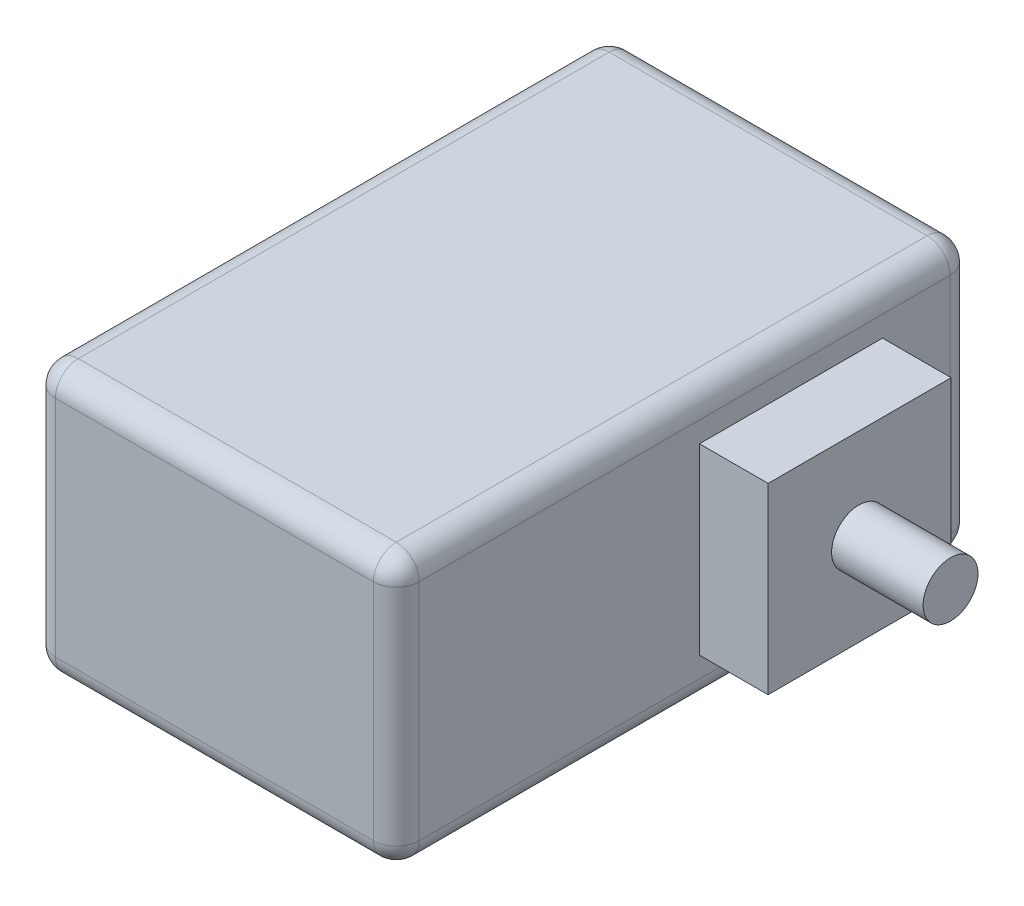
ISO-10303-21;
HEADER;
FILE_DESCRIPTION(('STEP AP214'),'2;1');
FILE_NAME('part.step','',(''),(''),'','','');
FILE_SCHEMA(('AUTOMOTIVE_DESIGN { 1 0 10303 214 1 1 1 1 }'));
ENDSEC;
DATA;
#1=APPLICATION_CONTEXT('core data for automotive mechanical design processes');
#2=APPLICATION_PROTOCOL_DEFINITION('international standard','automotive_design',2000,#1);
#3=PRODUCT_CONTEXT('',#1,'mechanical');
#4=PRODUCT('Part','Part','',(#3));
#5=PRODUCT_RELATED_PRODUCT_CATEGORY('part','',(#4));
#6=PRODUCT_DEFINITION_FORMATION('','',#4);
#7=PRODUCT_DEFINITION_CONTEXT('part definition',#1,'design');
#8=PRODUCT_DEFINITION('design','',#6,#7);
#9=PRODUCT_DEFINITION_SHAPE('','',#8);
#10=(LENGTH_UNIT() NAMED_UNIT(*) SI_UNIT(.MILLI.,.METRE.));
#11=(NAMED_UNIT(*) PLANE_ANGLE_UNIT() SI_UNIT($,.RADIAN.));
#12=(NAMED_UNIT(*) SI_UNIT($,.STERADIAN.) SOLID_ANGLE_UNIT());
#13=UNCERTAINTY_MEASURE_WITH_UNIT(LENGTH_MEASURE(1.E-05),#10,'distance_accuracy_value','');
#14=(GEOMETRIC_REPRESENTATION_CONTEXT(3) GLOBAL_UNCERTAINTY_ASSIGNED_CONTEXT((#13)) GLOBAL_UNIT_ASSIGNED_CONTEXT((#10,
#11,#12)) REPRESENTATION_CONTEXT('',''));
#15=CARTESIAN_POINT('',(0.,0.,0.));
#16=DIRECTION('',(0.,0.,1.));
#17=DIRECTION('',(1.,0.,0.));
#18=AXIS2_PLACEMENT_3D('',#15,#16,#17);
#19=CARTESIAN_POINT('',(79.5,-59.,126.));
#20=DIRECTION('',(-1.,0.,0.));
#21=DIRECTION('',(0.,0.,1.));
#22=AXIS2_PLACEMENT_3D('',#19,#20,#21);
#23=PLANE('',#22);
#24=DIRECTION('',(0.,1.,0.));
#25=VECTOR('',#24,1.);
#26=CARTESIAN_POINT('',(79.5,-59.,116.));
#27=LINE('',#26,#25);
#28=CARTESIAN_POINT('',(79.5,49.,116.));
#29=VERTEX_POINT('',#28);
#30=CARTESIAN_POINT('',(79.5,-49.,116.));
#31=VERTEX_POINT('',#30);
#32=EDGE_CURVE('E260',#29,#31,#27,.F.);
#33=ORIENTED_EDGE('',*,*,#32,.T.);
#34=DIRECTION('',(0.,0.,-1.));
#35=VECTOR('',#34,1.);
#36=CARTESIAN_POINT('',(79.5,-49.,126.));
#37=LINE('',#36,#35);
#38=CARTESIAN_POINT('',(79.5,-49.,-116.));
#39=VERTEX_POINT('',#38);
#40=EDGE_CURVE('E49',#31,#39,#37,.T.);
#41=ORIENTED_EDGE('',*,*,#40,.T.);
#42=DIRECTION('',(0.,1.,0.));
#43=VECTOR('',#42,1.);
#44=CARTESIAN_POINT('',(79.5,59.,-116.));
#45=LINE('',#44,#43);
#46=CARTESIAN_POINT('',(79.5,49.,-116.));
#47=VERTEX_POINT('',#46);
#48=EDGE_CURVE('E257',#39,#47,#45,.T.);
#49=ORIENTED_EDGE('',*,*,#48,.T.);
#50=DIRECTION('',(0.,0.,-1.));
#51=VECTOR('',#50,1.);
#52=CARTESIAN_POINT('',(79.5,49.,126.));
#53=LINE('',#52,#51);
#54=EDGE_CURVE('E254',#47,#29,#53,.F.);
#55=ORIENTED_EDGE('',*,*,#54,.T.);
#56=EDGE_LOOP('',(#33,#41,#49,#55));
#57=FACE_BOUND('',#56,.T.);
#58=DIRECTION('',(0.,1.,0.));
#59=VECTOR('',#58,1.);
#60=CARTESIAN_POINT('',(79.5,-40.,-86.5));
#61=LINE('',#60,#59);
#62=CARTESIAN_POINT('',(79.5,-40.,-86.5));
#63=VERTEX_POINT('',#62);
#64=CARTESIAN_POINT('',(79.5,40.,-86.5));
#65=VERTEX_POINT('',#64);
#66=EDGE_CURVE('E177',#63,#65,#61,.T.);
#67=ORIENTED_EDGE('',*,*,#66,.F.);
#68=DIRECTION('',(0.,0.,-1.));
#69=VECTOR('',#68,1.);
#70=CARTESIAN_POINT('',(79.5,-40.,-6.49999999999998));
#71=LINE('',#70,#69);
#72=CARTESIAN_POINT('',(79.5,-40.,-6.49999999999998));
#73=VERTEX_POINT('',#72);
#74=EDGE_CURVE('E174',#73,#63,#71,.T.);
#75=ORIENTED_EDGE('',*,*,#74,.F.);
#76=DIRECTION('',(0.,-1.,0.));
#77=VECTOR('',#76,1.);
#78=CARTESIAN_POINT('',(79.5,-40.,-6.49999999999998));
#79=LINE('',#78,#77);
#80=CARTESIAN_POINT('',(79.5,40.,-6.49999999999998));
#81=VERTEX_POINT('',#80);
#82=EDGE_CURVE('E62',#81,#73,#79,.T.);
#83=ORIENTED_EDGE('',*,*,#82,.F.);
#84=DIRECTION('',(0.,0.,1.));
#85=VECTOR('',#84,1.);
#86=CARTESIAN_POINT('',(79.5,40.,-6.49999999999998));
#87=LINE('',#86,#85);
#88=EDGE_CURVE('E57',#65,#81,#87,.T.);
#89=ORIENTED_EDGE('',*,*,#88,.F.);
#90=EDGE_LOOP('',(#67,#75,#83,#89));
#91=FACE_BOUND('',#90,.T.);
#92=ADVANCED_FACE('F39',(#57,#91),#23,.F.);
#93=CARTESIAN_POINT('',(-79.5,59.,126.));
#94=DIRECTION('',(0.,-1.,0.));
#95=DIRECTION('',(0.,0.,-1.));
#96=AXIS2_PLACEMENT_3D('',#93,#94,#95);
#97=PLANE('',#96);
#98=DIRECTION('',(-1.,0.,0.));
#99=VECTOR('',#98,1.);
#100=CARTESIAN_POINT('',(-79.5,59.,116.));
#101=LINE('',#100,#99);
#102=CARTESIAN_POINT('',(-69.5,59.,116.));
#103=VERTEX_POINT('',#102);
#104=CARTESIAN_POINT('',(69.5,59.,116.));
#105=VERTEX_POINT('',#104);
#106=EDGE_CURVE('E247',#103,#105,#101,.F.);
#107=ORIENTED_EDGE('',*,*,#106,.T.);
#108=DIRECTION('',(0.,0.,-1.));
#109=VECTOR('',#108,1.);
#110=CARTESIAN_POINT('',(69.5,59.,126.));
#111=LINE('',#110,#109);
#112=CARTESIAN_POINT('',(69.5,59.,-116.));
#113=VERTEX_POINT('',#112);
#114=EDGE_CURVE('E251',#105,#113,#111,.T.);
#115=ORIENTED_EDGE('',*,*,#114,.T.);
#116=DIRECTION('',(-1.,0.,0.));
#117=VECTOR('',#116,1.);
#118=CARTESIAN_POINT('',(-79.5,59.,-116.));
#119=LINE('',#118,#117);
#120=CARTESIAN_POINT('',(-69.5,59.,-116.));
#121=VERTEX_POINT('',#120);
#122=EDGE_CURVE('E244',#113,#121,#119,.T.);
#123=ORIENTED_EDGE('',*,*,#122,.T.);
#124=DIRECTION('',(0.,0.,-1.));
#125=VECTOR('',#124,1.);
#126=CARTESIAN_POINT('',(-69.5,59.,126.));
#127=LINE('',#126,#125);
#128=EDGE_CURVE('E241',#121,#103,#127,.F.);
#129=ORIENTED_EDGE('',*,*,#128,.T.);
#130=EDGE_LOOP('',(#107,#115,#123,#129));
#131=FACE_BOUND('',#130,.T.);
#132=ADVANCED_FACE('F370',(#131),#97,.F.);
#133=CARTESIAN_POINT('',(-79.5,-59.,126.));
#134=DIRECTION('',(1.,0.,0.));
#135=DIRECTION('',(0.,0.,-1.));
#136=AXIS2_PLACEMENT_3D('',#133,#134,#135);
#137=PLANE('',#136);
#138=CARTESIAN_POINT('',(-79.5,26.75,93.0823021399908));
#139=DIRECTION('',(-1.,0.,0.));
#140=DIRECTION('',(0.,0.,1.));
#141=AXIS2_PLACEMENT_3D('',#138,#139,#140);
#142=CIRCLE('',#141,8.50000000000001);
#143=CARTESIAN_POINT('',(-79.5,26.75,101.582302139991));
#144=VERTEX_POINT('',#143);
#145=EDGE_CURVE('E841',#144,#144,#142,.T.);
#146=ORIENTED_EDGE('',*,*,#145,.F.);
#147=EDGE_LOOP('',(#146));
#148=FACE_BOUND('',#147,.T.);
#149=CARTESIAN_POINT('',(-79.5,-26.75,93.0823021399908));
#150=DIRECTION('',(-1.,0.,0.));
#151=DIRECTION('',(0.,0.,1.));
#152=AXIS2_PLACEMENT_3D('',#149,#150,#151);
#153=CIRCLE('',#152,10.5);
#154=CARTESIAN_POINT('',(-79.5,-26.75,103.582302139991));
#155=VERTEX_POINT('',#154);
#156=EDGE_CURVE('E844',#155,#155,#153,.T.);
#157=ORIENTED_EDGE('',*,*,#156,.F.);
#158=EDGE_LOOP('',(#157));
#159=FACE_BOUND('',#158,.T.);
#160=DIRECTION('',(0.,-1.,0.));
#161=VECTOR('',#160,1.);
#162=CARTESIAN_POINT('',(-79.5,-59.,-116.));
#163=LINE('',#162,#161);
#164=CARTESIAN_POINT('',(-79.5,49.,-116.));
#165=VERTEX_POINT('',#164);
#166=CARTESIAN_POINT('',(-79.5,-49.,-116.));
#167=VERTEX_POINT('',#166);
#168=EDGE_CURVE('E195',#165,#167,#163,.T.);
#169=ORIENTED_EDGE('',*,*,#168,.T.);
#170=DIRECTION('',(0.,0.,-1.));
#171=VECTOR('',#170,1.);
#172=CARTESIAN_POINT('',(-79.5,-49.,126.));
#173=LINE('',#172,#171);
#174=CARTESIAN_POINT('',(-79.5,-49.,116.));
#175=VERTEX_POINT('',#174);
#176=EDGE_CURVE('E199',#167,#175,#173,.F.);
#177=ORIENTED_EDGE('',*,*,#176,.T.);
#178=DIRECTION('',(0.,-1.,0.));
#179=VECTOR('',#178,1.);
#180=CARTESIAN_POINT('',(-79.5,-59.,116.));
#181=LINE('',#180,#179);
#182=CARTESIAN_POINT('',(-79.5,49.,116.));
#183=VERTEX_POINT('',#182);
#184=EDGE_CURVE('E192',#175,#183,#181,.F.);
#185=ORIENTED_EDGE('',*,*,#184,.T.);
#186=DIRECTION('',(0.,0.,-1.));
#187=VECTOR('',#186,1.);
#188=CARTESIAN_POINT('',(-79.5,49.,126.));
#189=LINE('',#188,#187);
#190=EDGE_CURVE('E189',#183,#165,#189,.T.);
#191=ORIENTED_EDGE('',*,*,#190,.T.);
#192=EDGE_LOOP('',(#169,#177,#185,#191));
#193=FACE_BOUND('',#192,.T.);
#194=ADVANCED_FACE('F388',(#148,#159,#193),#137,.F.);
#195=CARTESIAN_POINT('',(-79.5,-59.,126.));
#196=DIRECTION('',(0.,1.,0.));
#197=DIRECTION('',(0.,0.,1.));
#198=AXIS2_PLACEMENT_3D('',#195,#196,#197);
#199=PLANE('',#198);
#200=CARTESIAN_POINT('',(-38.5,-59.,-8.99999999999999));
#201=DIRECTION('',(0.,-1.,0.));
#202=DIRECTION('',(0.,0.,-1.));
#203=AXIS2_PLACEMENT_3D('',#200,#201,#202);
#204=CIRCLE('',#203,7.94064544972005);
#205=CARTESIAN_POINT('',(-38.5,-59.,-16.94064544972));
#206=VERTEX_POINT('',#205);
#207=EDGE_CURVE('E892',#206,#206,#204,.T.);
#208=ORIENTED_EDGE('',*,*,#207,.F.);
#209=EDGE_LOOP('',(#208));
#210=FACE_BOUND('',#209,.T.);
#211=CARTESIAN_POINT('',(56.5,-59.,-8.99999999999999));
#212=DIRECTION('',(0.,-1.,0.));
#213=DIRECTION('',(0.,0.,-1.));
#214=AXIS2_PLACEMENT_3D('',#211,#212,#213);
#215=CIRCLE('',#214,7.94064544972005);
#216=CARTESIAN_POINT('',(56.5,-59.,-16.94064544972));
#217=VERTEX_POINT('',#216);
#218=EDGE_CURVE('E900',#217,#217,#215,.T.);
#219=ORIENTED_EDGE('',*,*,#218,.F.);
#220=EDGE_LOOP('',(#219));
#221=FACE_BOUND('',#220,.T.);
#222=CARTESIAN_POINT('',(56.5,-59.,-84.));
#223=DIRECTION('',(0.,-1.,0.));
#224=DIRECTION('',(0.,0.,-1.));
#225=AXIS2_PLACEMENT_3D('',#222,#223,#224);
#226=CIRCLE('',#225,7.94064544972005);
#227=CARTESIAN_POINT('',(56.5,-59.,-91.94064544972));
#228=VERTEX_POINT('',#227);
#229=EDGE_CURVE('E908',#228,#228,#226,.T.);
#230=ORIENTED_EDGE('',*,*,#229,.F.);
#231=EDGE_LOOP('',(#230));
#232=FACE_BOUND('',#231,.T.);
#233=CARTESIAN_POINT('',(-38.5,-59.,-84.));
#234=DIRECTION('',(0.,-1.,0.));
#235=DIRECTION('',(0.,0.,-1.));
#236=AXIS2_PLACEMENT_3D('',#233,#234,#235);
#237=CIRCLE('',#236,7.94064544972006);
#238=CARTESIAN_POINT('',(-38.5,-59.,-91.9406454497201));
#239=VERTEX_POINT('',#238);
#240=EDGE_CURVE('E855',#239,#239,#237,.T.);
#241=ORIENTED_EDGE('',*,*,#240,.F.);
#242=EDGE_LOOP('',(#241));
#243=FACE_BOUND('',#242,.T.);
#244=DIRECTION('',(1.,0.,0.));
#245=VECTOR('',#244,1.);
#246=CARTESIAN_POINT('',(79.5,-59.,-116.));
#247=LINE('',#246,#245);
#248=CARTESIAN_POINT('',(-69.5,-59.,-116.));
#249=VERTEX_POINT('',#248);
#250=CARTESIAN_POINT('',(69.5,-59.,-116.));
#251=VERTEX_POINT('',#250);
#252=EDGE_CURVE('E221',#249,#251,#247,.T.);
#253=ORIENTED_EDGE('',*,*,#252,.T.);
#254=DIRECTION('',(0.,0.,-1.));
#255=VECTOR('',#254,1.);
#256=CARTESIAN_POINT('',(69.5,-59.,126.));
#257=LINE('',#256,#255);
#258=CARTESIAN_POINT('',(69.5,-59.,116.));
#259=VERTEX_POINT('',#258);
#260=EDGE_CURVE('E225',#251,#259,#257,.F.);
#261=ORIENTED_EDGE('',*,*,#260,.T.);
#262=DIRECTION('',(1.,0.,0.));
#263=VECTOR('',#262,1.);
#264=CARTESIAN_POINT('',(-79.5,-59.,116.));
#265=LINE('',#264,#263);
#266=CARTESIAN_POINT('',(-69.5,-59.,116.));
#267=VERTEX_POINT('',#266);
#268=EDGE_CURVE('E218',#259,#267,#265,.F.);
#269=ORIENTED_EDGE('',*,*,#268,.T.);
#270=DIRECTION('',(0.,0.,-1.));
#271=VECTOR('',#270,1.);
#272=CARTESIAN_POINT('',(-69.5,-59.,126.));
#273=LINE('',#272,#271);
#274=EDGE_CURVE('E215',#267,#249,#273,.T.);
#275=ORIENTED_EDGE('',*,*,#274,.T.);
#276=EDGE_LOOP('',(#253,#261,#269,#275));
#277=FACE_BOUND('',#276,.T.);
#278=ADVANCED_FACE('F802',(#210,#221,#232,#243,#277),#199,.F.);
#279=CARTESIAN_POINT('',(0.,0.,126.));
#280=DIRECTION('',(0.,0.,-1.));
#281=DIRECTION('',(-1.,0.,0.));
#282=AXIS2_PLACEMENT_3D('',#279,#280,#281);
#283=PLANE('',#282);
#284=DIRECTION('',(-1.,0.,0.));
#285=VECTOR('',#284,1.);
#286=CARTESIAN_POINT('',(0.,49.,126.));
#287=LINE('',#286,#285);
#288=CARTESIAN_POINT('',(69.5,49.,126.));
#289=VERTEX_POINT('',#288);
#290=CARTESIAN_POINT('',(-69.5,49.,126.));
#291=VERTEX_POINT('',#290);
#292=EDGE_CURVE('E231',#289,#291,#287,.T.);
#293=ORIENTED_EDGE('',*,*,#292,.T.);
#294=DIRECTION('',(0.,-1.,0.));
#295=VECTOR('',#294,1.);
#296=CARTESIAN_POINT('',(-69.5,0.,126.));
#297=LINE('',#296,#295);
#298=CARTESIAN_POINT('',(-69.5,-49.,126.));
#299=VERTEX_POINT('',#298);
#300=EDGE_CURVE('E238',#291,#299,#297,.T.);
#301=ORIENTED_EDGE('',*,*,#300,.T.);
#302=DIRECTION('',(1.,0.,0.));
#303=VECTOR('',#302,1.);
#304=CARTESIAN_POINT('',(0.,-49.,126.));
#305=LINE('',#304,#303);
#306=CARTESIAN_POINT('',(69.5,-49.,126.));
#307=VERTEX_POINT('',#306);
#308=EDGE_CURVE('E234',#299,#307,#305,.T.);
#309=ORIENTED_EDGE('',*,*,#308,.T.);
#310=DIRECTION('',(0.,1.,0.));
#311=VECTOR('',#310,1.);
#312=CARTESIAN_POINT('',(69.5,0.,126.));
#313=LINE('',#312,#311);
#314=EDGE_CURVE('E228',#307,#289,#313,.T.);
#315=ORIENTED_EDGE('',*,*,#314,.T.);
#316=EDGE_LOOP('',(#293,#301,#309,#315));
#317=FACE_BOUND('',#316,.T.);
#318=ADVANCED_FACE('F398',(#317),#283,.F.);
#319=CARTESIAN_POINT('',(0.,0.,-126.));
#320=DIRECTION('',(0.,0.,-1.));
#321=DIRECTION('',(-1.,0.,0.));
#322=AXIS2_PLACEMENT_3D('',#319,#320,#321);
#323=PLANE('',#322);
#324=DIRECTION('',(1.,0.,0.));
#325=VECTOR('',#324,1.);
#326=CARTESIAN_POINT('',(-79.5,-49.,-126.));
#327=LINE('',#326,#325);
#328=CARTESIAN_POINT('',(69.5,-49.,-126.));
#329=VERTEX_POINT('',#328);
#330=CARTESIAN_POINT('',(-69.5,-49.,-126.));
#331=VERTEX_POINT('',#330);
#332=EDGE_CURVE('E208',#329,#331,#327,.F.);
#333=ORIENTED_EDGE('',*,*,#332,.T.);
#334=DIRECTION('',(0.,-1.,0.));
#335=VECTOR('',#334,1.);
#336=CARTESIAN_POINT('',(-69.5,59.,-126.));
#337=LINE('',#336,#335);
#338=CARTESIAN_POINT('',(-69.5,49.,-126.));
#339=VERTEX_POINT('',#338);
#340=EDGE_CURVE('E211',#331,#339,#337,.F.);
#341=ORIENTED_EDGE('',*,*,#340,.T.);
#342=DIRECTION('',(-1.,0.,0.));
#343=VECTOR('',#342,1.);
#344=CARTESIAN_POINT('',(79.5,49.,-126.));
#345=LINE('',#344,#343);
#346=CARTESIAN_POINT('',(69.5,49.,-126.));
#347=VERTEX_POINT('',#346);
#348=EDGE_CURVE('E205',#339,#347,#345,.F.);
#349=ORIENTED_EDGE('',*,*,#348,.T.);
#350=DIRECTION('',(0.,1.,0.));
#351=VECTOR('',#350,1.);
#352=CARTESIAN_POINT('',(69.5,-59.,-126.));
#353=LINE('',#352,#351);
#354=EDGE_CURVE('E202',#347,#329,#353,.F.);
#355=ORIENTED_EDGE('',*,*,#354,.T.);
#356=EDGE_LOOP('',(#333,#341,#349,#355));
#357=FACE_BOUND('',#356,.T.);
#358=ADVANCED_FACE('F425',(#357),#323,.T.);
#359=CARTESIAN_POINT('',(69.5,0.,116.));
#360=DIRECTION('',(0.,1.,0.));
#361=DIRECTION('',(0.,0.,1.));
#362=AXIS2_PLACEMENT_3D('',#359,#360,#361);
#363=CYLINDRICAL_SURFACE('',#362,10.);
#364=CARTESIAN_POINT('',(69.5,49.,116.));
#365=DIRECTION('',(0.,1.,0.));
#366=DIRECTION('',(0.,0.,1.));
#367=AXIS2_PLACEMENT_3D('',#364,#365,#366);
#368=CIRCLE('',#367,10.);
#369=EDGE_CURVE('E43',#289,#29,#368,.T.);
#370=ORIENTED_EDGE('',*,*,#369,.F.);
#371=ORIENTED_EDGE('',*,*,#314,.F.);
#372=CARTESIAN_POINT('',(69.5,-49.,116.));
#373=DIRECTION('',(0.,-1.,0.));
#374=DIRECTION('',(0.,0.,-1.));
#375=AXIS2_PLACEMENT_3D('',#372,#373,#374);
#376=CIRCLE('',#375,10.);
#377=EDGE_CURVE('E345',#31,#307,#376,.T.);
#378=ORIENTED_EDGE('',*,*,#377,.F.);
#379=ORIENTED_EDGE('',*,*,#32,.F.);
#380=EDGE_LOOP('',(#370,#371,#378,#379));
#381=FACE_BOUND('',#380,.T.);
#382=ADVANCED_FACE('F41',(#381),#363,.T.);
#383=CARTESIAN_POINT('',(69.5,49.,116.));
#384=DIRECTION('',(0.,0.,1.));
#385=DIRECTION('',(1.,0.,0.));
#386=AXIS2_PLACEMENT_3D('',#383,#384,#385);
#387=SPHERICAL_SURFACE('',#386,10.);
#388=CARTESIAN_POINT('',(69.5,49.,116.));
#389=DIRECTION('',(1.,0.,0.));
#390=DIRECTION('',(0.,0.,-1.));
#391=AXIS2_PLACEMENT_3D('',#388,#389,#390);
#392=CIRCLE('',#391,10.);
#393=EDGE_CURVE('E338',#289,#105,#392,.F.);
#394=ORIENTED_EDGE('',*,*,#393,.F.);
#395=ORIENTED_EDGE('',*,*,#369,.T.);
#396=CARTESIAN_POINT('',(69.5,49.,116.));
#397=DIRECTION('',(0.,0.,1.));
#398=DIRECTION('',(1.,0.,0.));
#399=AXIS2_PLACEMENT_3D('',#396,#397,#398);
#400=CIRCLE('',#399,10.);
#401=EDGE_CURVE('E342',#105,#29,#400,.F.);
#402=ORIENTED_EDGE('',*,*,#401,.F.);
#403=EDGE_LOOP('',(#394,#395,#402));
#404=FACE_BOUND('',#403,.T.);
#405=ADVANCED_FACE('F359',(#404),#387,.T.);
#406=CARTESIAN_POINT('',(69.5,-49.,116.));
#407=DIRECTION('',(0.,0.,1.));
#408=DIRECTION('',(1.,0.,0.));
#409=AXIS2_PLACEMENT_3D('',#406,#407,#408);
#410=SPHERICAL_SURFACE('',#409,10.);
#411=CARTESIAN_POINT('',(69.5,-49.,116.));
#412=DIRECTION('',(0.,0.,1.));
#413=DIRECTION('',(1.,0.,0.));
#414=AXIS2_PLACEMENT_3D('',#411,#412,#413);
#415=CIRCLE('',#414,10.);
#416=EDGE_CURVE('E331',#31,#259,#415,.F.);
#417=ORIENTED_EDGE('',*,*,#416,.F.);
#418=ORIENTED_EDGE('',*,*,#377,.T.);
#419=CARTESIAN_POINT('',(69.5,-49.,116.));
#420=DIRECTION('',(1.,0.,0.));
#421=DIRECTION('',(0.,0.,-1.));
#422=AXIS2_PLACEMENT_3D('',#419,#420,#421);
#423=CIRCLE('',#422,10.);
#424=EDGE_CURVE('E335',#259,#307,#423,.F.);
#425=ORIENTED_EDGE('',*,*,#424,.F.);
#426=EDGE_LOOP('',(#417,#418,#425));
#427=FACE_BOUND('',#426,.T.);
#428=ADVANCED_FACE('F404',(#427),#410,.T.);
#429=CARTESIAN_POINT('',(69.5,49.,126.));
#430=DIRECTION('',(0.,0.,-1.));
#431=DIRECTION('',(-1.,0.,0.));
#432=AXIS2_PLACEMENT_3D('',#429,#430,#431);
#433=CYLINDRICAL_SURFACE('',#432,10.);
#434=ORIENTED_EDGE('',*,*,#401,.T.);
#435=ORIENTED_EDGE('',*,*,#54,.F.);
#436=CARTESIAN_POINT('',(69.5,49.,-116.));
#437=DIRECTION('',(0.,0.,-1.));
#438=DIRECTION('',(-1.,0.,0.));
#439=AXIS2_PLACEMENT_3D('',#436,#437,#438);
#440=CIRCLE('',#439,10.);
#441=EDGE_CURVE('E323',#113,#47,#440,.T.);
#442=ORIENTED_EDGE('',*,*,#441,.F.);
#443=ORIENTED_EDGE('',*,*,#114,.F.);
#444=EDGE_LOOP('',(#434,#435,#442,#443));
#445=FACE_BOUND('',#444,.T.);
#446=ADVANCED_FACE('F365',(#445),#433,.T.);
#447=CARTESIAN_POINT('',(0.,49.,116.));
#448=DIRECTION('',(-1.,0.,0.));
#449=DIRECTION('',(0.,0.,1.));
#450=AXIS2_PLACEMENT_3D('',#447,#448,#449);
#451=CYLINDRICAL_SURFACE('',#450,10.);
#452=ORIENTED_EDGE('',*,*,#393,.T.);
#453=ORIENTED_EDGE('',*,*,#106,.F.);
#454=CARTESIAN_POINT('',(-69.5,49.,116.));
#455=DIRECTION('',(-1.,0.,0.));
#456=DIRECTION('',(0.,0.,1.));
#457=AXIS2_PLACEMENT_3D('',#454,#455,#456);
#458=CIRCLE('',#457,10.);
#459=EDGE_CURVE('E319',#291,#103,#458,.T.);
#460=ORIENTED_EDGE('',*,*,#459,.F.);
#461=ORIENTED_EDGE('',*,*,#292,.F.);
#462=EDGE_LOOP('',(#452,#453,#460,#461));
#463=FACE_BOUND('',#462,.T.);
#464=ADVANCED_FACE('F376',(#463),#451,.T.);
#465=CARTESIAN_POINT('',(-69.5,0.,116.));
#466=DIRECTION('',(0.,-1.,0.));
#467=DIRECTION('',(0.,0.,-1.));
#468=AXIS2_PLACEMENT_3D('',#465,#466,#467);
#469=CYLINDRICAL_SURFACE('',#468,10.);
#470=CARTESIAN_POINT('',(-69.5,-49.,116.));
#471=DIRECTION('',(0.,-1.,0.));
#472=DIRECTION('',(0.,0.,-1.));
#473=AXIS2_PLACEMENT_3D('',#470,#471,#472);
#474=CIRCLE('',#473,10.);
#475=EDGE_CURVE('E311',#299,#175,#474,.T.);
#476=ORIENTED_EDGE('',*,*,#475,.F.);
#477=ORIENTED_EDGE('',*,*,#300,.F.);
#478=CARTESIAN_POINT('',(-69.5,49.,116.));
#479=DIRECTION('',(0.,1.,0.));
#480=DIRECTION('',(0.,0.,1.));
#481=AXIS2_PLACEMENT_3D('',#478,#479,#480);
#482=CIRCLE('',#481,10.);
#483=EDGE_CURVE('E315',#183,#291,#482,.T.);
#484=ORIENTED_EDGE('',*,*,#483,.F.);
#485=ORIENTED_EDGE('',*,*,#184,.F.);
#486=EDGE_LOOP('',(#476,#477,#484,#485));
#487=FACE_BOUND('',#486,.T.);
#488=ADVANCED_FACE('F395',(#487),#469,.T.);
#489=CARTESIAN_POINT('',(0.,-49.,116.));
#490=DIRECTION('',(1.,0.,0.));
#491=DIRECTION('',(0.,0.,-1.));
#492=AXIS2_PLACEMENT_3D('',#489,#490,#491);
#493=CYLINDRICAL_SURFACE('',#492,10.);
#494=ORIENTED_EDGE('',*,*,#424,.T.);
#495=ORIENTED_EDGE('',*,*,#308,.F.);
#496=CARTESIAN_POINT('',(-69.5,-49.,116.));
#497=DIRECTION('',(-1.,0.,0.));
#498=DIRECTION('',(0.,0.,1.));
#499=AXIS2_PLACEMENT_3D('',#496,#497,#498);
#500=CIRCLE('',#499,10.);
#501=EDGE_CURVE('E307',#267,#299,#500,.T.);
#502=ORIENTED_EDGE('',*,*,#501,.F.);
#503=ORIENTED_EDGE('',*,*,#268,.F.);
#504=EDGE_LOOP('',(#494,#495,#502,#503));
#505=FACE_BOUND('',#504,.T.);
#506=ADVANCED_FACE('F401',(#505),#493,.T.);
#507=CARTESIAN_POINT('',(69.5,-49.,126.));
#508=DIRECTION('',(0.,0.,-1.));
#509=DIRECTION('',(-1.,0.,0.));
#510=AXIS2_PLACEMENT_3D('',#507,#508,#509);
#511=CYLINDRICAL_SURFACE('',#510,10.);
#512=ORIENTED_EDGE('',*,*,#416,.T.);
#513=ORIENTED_EDGE('',*,*,#260,.F.);
#514=CARTESIAN_POINT('',(69.5,-49.,-116.));
#515=DIRECTION('',(0.,0.,-1.));
#516=DIRECTION('',(-1.,0.,0.));
#517=AXIS2_PLACEMENT_3D('',#514,#515,#516);
#518=CIRCLE('',#517,10.);
#519=EDGE_CURVE('E303',#39,#251,#518,.T.);
#520=ORIENTED_EDGE('',*,*,#519,.F.);
#521=ORIENTED_EDGE('',*,*,#40,.F.);
#522=EDGE_LOOP('',(#512,#513,#520,#521));
#523=FACE_BOUND('',#522,.T.);
#524=ADVANCED_FACE('F415',(#523),#511,.T.);
#525=CARTESIAN_POINT('',(69.5,-59.,-116.));
#526=DIRECTION('',(0.,-1.,0.));
#527=DIRECTION('',(0.,0.,-1.));
#528=AXIS2_PLACEMENT_3D('',#525,#526,#527);
#529=CYLINDRICAL_SURFACE('',#528,10.);
#530=CARTESIAN_POINT('',(69.5,49.,-116.));
#531=DIRECTION('',(0.,1.,0.));
#532=DIRECTION('',(0.,0.,1.));
#533=AXIS2_PLACEMENT_3D('',#530,#531,#532);
#534=CIRCLE('',#533,10.);
#535=EDGE_CURVE('E327',#47,#347,#534,.T.);
#536=ORIENTED_EDGE('',*,*,#535,.F.);
#537=ORIENTED_EDGE('',*,*,#48,.F.);
#538=CARTESIAN_POINT('',(69.5,-49.,-116.));
#539=DIRECTION('',(0.,-1.,0.));
#540=DIRECTION('',(0.,0.,-1.));
#541=AXIS2_PLACEMENT_3D('',#538,#539,#540);
#542=CIRCLE('',#541,10.);
#543=EDGE_CURVE('E299',#329,#39,#542,.T.);
#544=ORIENTED_EDGE('',*,*,#543,.F.);
#545=ORIENTED_EDGE('',*,*,#354,.F.);
#546=EDGE_LOOP('',(#536,#537,#544,#545));
#547=FACE_BOUND('',#546,.T.);
#548=ADVANCED_FACE('F412',(#547),#529,.T.);
#549=CARTESIAN_POINT('',(69.5,49.,-116.));
#550=DIRECTION('',(0.,0.,1.));
#551=DIRECTION('',(1.,0.,0.));
#552=AXIS2_PLACEMENT_3D('',#549,#550,#551);
#553=SPHERICAL_SURFACE('',#552,10.);
#554=ORIENTED_EDGE('',*,*,#441,.T.);
#555=ORIENTED_EDGE('',*,*,#535,.T.);
#556=CARTESIAN_POINT('',(69.5,49.,-116.));
#557=DIRECTION('',(1.,0.,0.));
#558=DIRECTION('',(0.,1.,0.));
#559=AXIS2_PLACEMENT_3D('',#556,#557,#558);
#560=CIRCLE('',#559,10.);
#561=EDGE_CURVE('E295',#113,#347,#560,.F.);
#562=ORIENTED_EDGE('',*,*,#561,.F.);
#563=EDGE_LOOP('',(#554,#555,#562));
#564=FACE_BOUND('',#563,.T.);
#565=ADVANCED_FACE('F428',(#564),#553,.T.);
#566=CARTESIAN_POINT('',(-69.5,49.,116.));
#567=DIRECTION('',(0.,0.,1.));
#568=DIRECTION('',(1.,0.,0.));
#569=AXIS2_PLACEMENT_3D('',#566,#567,#568);
#570=SPHERICAL_SURFACE('',#569,10.);
#571=ORIENTED_EDGE('',*,*,#483,.T.);
#572=ORIENTED_EDGE('',*,*,#459,.T.);
#573=CARTESIAN_POINT('',(-69.5,49.,116.));
#574=DIRECTION('',(0.,0.,1.));
#575=DIRECTION('',(1.,0.,0.));
#576=AXIS2_PLACEMENT_3D('',#573,#574,#575);
#577=CIRCLE('',#576,10.);
#578=EDGE_CURVE('E291',#183,#103,#577,.F.);
#579=ORIENTED_EDGE('',*,*,#578,.F.);
#580=EDGE_LOOP('',(#571,#572,#579));
#581=FACE_BOUND('',#580,.T.);
#582=ADVANCED_FACE('F379',(#581),#570,.T.);
#583=CARTESIAN_POINT('',(-69.5,-49.,116.));
#584=DIRECTION('',(0.,0.,1.));
#585=DIRECTION('',(1.,0.,0.));
#586=AXIS2_PLACEMENT_3D('',#583,#584,#585);
#587=SPHERICAL_SURFACE('',#586,10.);
#588=ORIENTED_EDGE('',*,*,#501,.T.);
#589=ORIENTED_EDGE('',*,*,#475,.T.);
#590=CARTESIAN_POINT('',(-69.5,-49.,116.));
#591=DIRECTION('',(0.,0.,1.));
#592=DIRECTION('',(1.,0.,0.));
#593=AXIS2_PLACEMENT_3D('',#590,#591,#592);
#594=CIRCLE('',#593,10.);
#595=EDGE_CURVE('E287',#267,#175,#594,.F.);
#596=ORIENTED_EDGE('',*,*,#595,.F.);
#597=EDGE_LOOP('',(#588,#589,#596));
#598=FACE_BOUND('',#597,.T.);
#599=ADVANCED_FACE('F443',(#598),#587,.T.);
#600=CARTESIAN_POINT('',(69.5,-49.,-116.));
#601=DIRECTION('',(0.,0.,1.));
#602=DIRECTION('',(1.,0.,0.));
#603=AXIS2_PLACEMENT_3D('',#600,#601,#602);
#604=SPHERICAL_SURFACE('',#603,10.);
#605=ORIENTED_EDGE('',*,*,#543,.T.);
#606=ORIENTED_EDGE('',*,*,#519,.T.);
#607=CARTESIAN_POINT('',(69.5,-49.,-116.));
#608=DIRECTION('',(1.,0.,0.));
#609=DIRECTION('',(0.,0.,-1.));
#610=AXIS2_PLACEMENT_3D('',#607,#608,#609);
#611=CIRCLE('',#610,10.);
#612=EDGE_CURVE('E284',#329,#251,#611,.F.);
#613=ORIENTED_EDGE('',*,*,#612,.F.);
#614=EDGE_LOOP('',(#605,#606,#613));
#615=FACE_BOUND('',#614,.T.);
#616=ADVANCED_FACE('F417',(#615),#604,.T.);
#617=CARTESIAN_POINT('',(-79.5,49.,-116.));
#618=DIRECTION('',(1.,0.,0.));
#619=DIRECTION('',(0.,0.,-1.));
#620=AXIS2_PLACEMENT_3D('',#617,#618,#619);
#621=CYLINDRICAL_SURFACE('',#620,10.);
#622=ORIENTED_EDGE('',*,*,#561,.T.);
#623=ORIENTED_EDGE('',*,*,#348,.F.);
#624=CARTESIAN_POINT('',(-69.5,49.,-116.));
#625=DIRECTION('',(-1.,0.,0.));
#626=DIRECTION('',(0.,0.,1.));
#627=AXIS2_PLACEMENT_3D('',#624,#625,#626);
#628=CIRCLE('',#627,10.);
#629=EDGE_CURVE('E280',#121,#339,#628,.T.);
#630=ORIENTED_EDGE('',*,*,#629,.F.);
#631=ORIENTED_EDGE('',*,*,#122,.F.);
#632=EDGE_LOOP('',(#622,#623,#630,#631));
#633=FACE_BOUND('',#632,.T.);
#634=ADVANCED_FACE('F430',(#633),#621,.T.);
#635=CARTESIAN_POINT('',(-69.5,49.,126.));
#636=DIRECTION('',(0.,0.,-1.));
#637=DIRECTION('',(-1.,0.,0.));
#638=AXIS2_PLACEMENT_3D('',#635,#636,#637);
#639=CYLINDRICAL_SURFACE('',#638,10.);
#640=ORIENTED_EDGE('',*,*,#578,.T.);
#641=ORIENTED_EDGE('',*,*,#128,.F.);
#642=CARTESIAN_POINT('',(-69.5,49.,-116.));
#643=DIRECTION('',(0.,0.,-1.));
#644=DIRECTION('',(-1.,0.,0.));
#645=AXIS2_PLACEMENT_3D('',#642,#643,#644);
#646=CIRCLE('',#645,10.);
#647=EDGE_CURVE('E276',#165,#121,#646,.T.);
#648=ORIENTED_EDGE('',*,*,#647,.F.);
#649=ORIENTED_EDGE('',*,*,#190,.F.);
#650=EDGE_LOOP('',(#640,#641,#648,#649));
#651=FACE_BOUND('',#650,.T.);
#652=ADVANCED_FACE('F383',(#651),#639,.T.);
#653=CARTESIAN_POINT('',(-69.5,-49.,126.));
#654=DIRECTION('',(0.,0.,-1.));
#655=DIRECTION('',(-1.,0.,0.));
#656=AXIS2_PLACEMENT_3D('',#653,#654,#655);
#657=CYLINDRICAL_SURFACE('',#656,10.);
#658=ORIENTED_EDGE('',*,*,#595,.T.);
#659=ORIENTED_EDGE('',*,*,#176,.F.);
#660=CARTESIAN_POINT('',(-69.5,-49.,-116.));
#661=DIRECTION('',(0.,0.,-1.));
#662=DIRECTION('',(-1.,0.,0.));
#663=AXIS2_PLACEMENT_3D('',#660,#661,#662);
#664=CIRCLE('',#663,10.);
#665=EDGE_CURVE('E272',#249,#167,#664,.T.);
#666=ORIENTED_EDGE('',*,*,#665,.F.);
#667=ORIENTED_EDGE('',*,*,#274,.F.);
#668=EDGE_LOOP('',(#658,#659,#666,#667));
#669=FACE_BOUND('',#668,.T.);
#670=ADVANCED_FACE('F441',(#669),#657,.T.);
#671=CARTESIAN_POINT('',(-79.5,-49.,-116.));
#672=DIRECTION('',(-1.,0.,0.));
#673=DIRECTION('',(0.,0.,1.));
#674=AXIS2_PLACEMENT_3D('',#671,#672,#673);
#675=CYLINDRICAL_SURFACE('',#674,10.);
#676=ORIENTED_EDGE('',*,*,#612,.T.);
#677=ORIENTED_EDGE('',*,*,#252,.F.);
#678=CARTESIAN_POINT('',(-69.5,-49.,-116.));
#679=DIRECTION('',(-1.,0.,0.));
#680=DIRECTION('',(0.,0.,1.));
#681=AXIS2_PLACEMENT_3D('',#678,#679,#680);
#682=CIRCLE('',#681,10.);
#683=EDGE_CURVE('E268',#331,#249,#682,.T.);
#684=ORIENTED_EDGE('',*,*,#683,.F.);
#685=ORIENTED_EDGE('',*,*,#332,.F.);
#686=EDGE_LOOP('',(#676,#677,#684,#685));
#687=FACE_BOUND('',#686,.T.);
#688=ADVANCED_FACE('F422',(#687),#675,.T.);
#689=CARTESIAN_POINT('',(-69.5,49.,-116.));
#690=DIRECTION('',(0.,0.,1.));
#691=DIRECTION('',(1.,0.,0.));
#692=AXIS2_PLACEMENT_3D('',#689,#690,#691);
#693=SPHERICAL_SURFACE('',#692,10.);
#694=ORIENTED_EDGE('',*,*,#647,.T.);
#695=ORIENTED_EDGE('',*,*,#629,.T.);
#696=CARTESIAN_POINT('',(-69.5,49.,-116.));
#697=DIRECTION('',(0.,1.,0.));
#698=DIRECTION('',(-1.,0.,0.));
#699=AXIS2_PLACEMENT_3D('',#696,#697,#698);
#700=CIRCLE('',#699,10.);
#701=EDGE_CURVE('E183',#165,#339,#700,.F.);
#702=ORIENTED_EDGE('',*,*,#701,.F.);
#703=EDGE_LOOP('',(#694,#695,#702));
#704=FACE_BOUND('',#703,.T.);
#705=ADVANCED_FACE('F432',(#704),#693,.T.);
#706=CARTESIAN_POINT('',(-69.5,-49.,-116.));
#707=DIRECTION('',(0.,0.,1.));
#708=DIRECTION('',(1.,0.,0.));
#709=AXIS2_PLACEMENT_3D('',#706,#707,#708);
#710=SPHERICAL_SURFACE('',#709,10.);
#711=ORIENTED_EDGE('',*,*,#683,.T.);
#712=ORIENTED_EDGE('',*,*,#665,.T.);
#713=CARTESIAN_POINT('',(-69.5,-49.,-116.));
#714=DIRECTION('',(0.,-1.,0.));
#715=DIRECTION('',(0.,0.,-1.));
#716=AXIS2_PLACEMENT_3D('',#713,#714,#715);
#717=CIRCLE('',#716,10.);
#718=EDGE_CURVE('E179',#331,#167,#717,.F.);
#719=ORIENTED_EDGE('',*,*,#718,.F.);
#720=EDGE_LOOP('',(#711,#712,#719));
#721=FACE_BOUND('',#720,.T.);
#722=ADVANCED_FACE('F438',(#721),#710,.T.);
#723=CARTESIAN_POINT('',(-69.5,-59.,-116.));
#724=DIRECTION('',(0.,1.,0.));
#725=DIRECTION('',(0.,0.,1.));
#726=AXIS2_PLACEMENT_3D('',#723,#724,#725);
#727=CYLINDRICAL_SURFACE('',#726,10.);
#728=ORIENTED_EDGE('',*,*,#701,.T.);
#729=ORIENTED_EDGE('',*,*,#340,.F.);
#730=ORIENTED_EDGE('',*,*,#718,.T.);
#731=ORIENTED_EDGE('',*,*,#168,.F.);
#732=EDGE_LOOP('',(#728,#729,#730,#731));
#733=FACE_BOUND('',#732,.T.);
#734=ADVANCED_FACE('F434',(#733),#727,.T.);
#735=CARTESIAN_POINT('',(109.5,-40.,-86.5));
#736=DIRECTION('',(0.,0.,1.));
#737=DIRECTION('',(1.,0.,0.));
#738=AXIS2_PLACEMENT_3D('',#735,#736,#737);
#739=PLANE('',#738);
#740=ORIENTED_EDGE('',*,*,#66,.T.);
#741=DIRECTION('',(-1.,0.,0.));
#742=VECTOR('',#741,1.);
#743=CARTESIAN_POINT('',(109.5,40.,-86.5));
#744=LINE('',#743,#742);
#745=CARTESIAN_POINT('',(109.5,40.,-86.5));
#746=VERTEX_POINT('',#745);
#747=EDGE_CURVE('E156',#746,#65,#744,.T.);
#748=ORIENTED_EDGE('',*,*,#747,.F.);
#749=DIRECTION('',(0.,1.,0.));
#750=VECTOR('',#749,1.);
#751=CARTESIAN_POINT('',(109.5,-40.,-86.5));
#752=LINE('',#751,#750);
#753=CARTESIAN_POINT('',(109.5,-40.,-86.5));
#754=VERTEX_POINT('',#753);
#755=EDGE_CURVE('E164',#754,#746,#752,.T.);
#756=ORIENTED_EDGE('',*,*,#755,.F.);
#757=DIRECTION('',(-1.,0.,0.));
#758=VECTOR('',#757,1.);
#759=CARTESIAN_POINT('',(109.5,-40.,-86.5));
#760=LINE('',#759,#758);
#761=EDGE_CURVE('E868',#754,#63,#760,.T.);
#762=ORIENTED_EDGE('',*,*,#761,.T.);
#763=EDGE_LOOP('',(#740,#748,#756,#762));
#764=FACE_BOUND('',#763,.T.);
#765=ADVANCED_FACE('F176',(#764),#739,.F.);
#766=CARTESIAN_POINT('',(109.5,40.,-6.49999999999998));
#767=DIRECTION('',(0.,-1.,0.));
#768=DIRECTION('',(0.,0.,-1.));
#769=AXIS2_PLACEMENT_3D('',#766,#767,#768);
#770=PLANE('',#769);
#771=ORIENTED_EDGE('',*,*,#88,.T.);
#772=DIRECTION('',(-1.,0.,0.));
#773=VECTOR('',#772,1.);
#774=CARTESIAN_POINT('',(109.5,40.,-6.49999999999998));
#775=LINE('',#774,#773);
#776=CARTESIAN_POINT('',(109.5,40.,-6.49999999999998));
#777=VERTEX_POINT('',#776);
#778=EDGE_CURVE('E159',#777,#81,#775,.T.);
#779=ORIENTED_EDGE('',*,*,#778,.F.);
#780=DIRECTION('',(0.,0.,1.));
#781=VECTOR('',#780,1.);
#782=CARTESIAN_POINT('',(109.5,40.,-6.49999999999998));
#783=LINE('',#782,#781);
#784=EDGE_CURVE('E152',#746,#777,#783,.T.);
#785=ORIENTED_EDGE('',*,*,#784,.F.);
#786=ORIENTED_EDGE('',*,*,#747,.T.);
#787=EDGE_LOOP('',(#771,#779,#785,#786));
#788=FACE_BOUND('',#787,.T.);
#789=ADVANCED_FACE('F154',(#788),#770,.F.);
#790=CARTESIAN_POINT('',(109.5,-40.,-6.49999999999998));
#791=DIRECTION('',(0.,0.,-1.));
#792=DIRECTION('',(-1.,0.,0.));
#793=AXIS2_PLACEMENT_3D('',#790,#791,#792);
#794=PLANE('',#793);
#795=ORIENTED_EDGE('',*,*,#82,.T.);
#796=DIRECTION('',(-1.,0.,0.));
#797=VECTOR('',#796,1.);
#798=CARTESIAN_POINT('',(109.5,-40.,-6.49999999999998));
#799=LINE('',#798,#797);
#800=CARTESIAN_POINT('',(109.5,-40.,-6.49999999999998));
#801=VERTEX_POINT('',#800);
#802=EDGE_CURVE('E185',#801,#73,#799,.T.);
#803=ORIENTED_EDGE('',*,*,#802,.F.);
#804=DIRECTION('',(0.,-1.,0.));
#805=VECTOR('',#804,1.);
#806=CARTESIAN_POINT('',(109.5,-40.,-6.49999999999998));
#807=LINE('',#806,#805);
#808=EDGE_CURVE('E163',#777,#801,#807,.T.);
#809=ORIENTED_EDGE('',*,*,#808,.F.);
#810=ORIENTED_EDGE('',*,*,#778,.T.);
#811=EDGE_LOOP('',(#795,#803,#809,#810));
#812=FACE_BOUND('',#811,.T.);
#813=ADVANCED_FACE('F513',(#812),#794,.F.);
#814=CARTESIAN_POINT('',(109.5,-40.,-6.49999999999998));
#815=DIRECTION('',(0.,1.,0.));
#816=DIRECTION('',(0.,0.,1.));
#817=AXIS2_PLACEMENT_3D('',#814,#815,#816);
#818=PLANE('',#817);
#819=ORIENTED_EDGE('',*,*,#74,.T.);
#820=ORIENTED_EDGE('',*,*,#761,.F.);
#821=DIRECTION('',(0.,0.,-1.));
#822=VECTOR('',#821,1.);
#823=CARTESIAN_POINT('',(109.5,-40.,-6.49999999999998));
#824=LINE('',#823,#822);
#825=EDGE_CURVE('E169',#801,#754,#824,.T.);
#826=ORIENTED_EDGE('',*,*,#825,.F.);
#827=ORIENTED_EDGE('',*,*,#802,.T.);
#828=EDGE_LOOP('',(#819,#820,#826,#827));
#829=FACE_BOUND('',#828,.T.);
#830=ADVANCED_FACE('F520',(#829),#818,.F.);
#831=CARTESIAN_POINT('',(109.5,0.,0.));
#832=DIRECTION('',(-1.,0.,0.));
#833=DIRECTION('',(0.,0.,1.));
#834=AXIS2_PLACEMENT_3D('',#831,#832,#833);
#835=PLANE('',#834);
#836=CARTESIAN_POINT('',(109.5,0.,-46.2383803371672));
#837=DIRECTION('',(1.,0.,0.));
#838=DIRECTION('',(0.,0.,-1.));
#839=AXIS2_PLACEMENT_3D('',#836,#837,#838);
#840=CIRCLE('',#839,12.);
#841=CARTESIAN_POINT('',(109.5,0.,-58.2383803371672));
#842=VERTEX_POINT('',#841);
#843=EDGE_CURVE('E11',#842,#842,#840,.T.);
#844=ORIENTED_EDGE('',*,*,#843,.F.);
#845=EDGE_LOOP('',(#844));
#846=FACE_BOUND('',#845,.T.);
#847=ORIENTED_EDGE('',*,*,#755,.T.);
#848=ORIENTED_EDGE('',*,*,#784,.T.);
#849=ORIENTED_EDGE('',*,*,#808,.T.);
#850=ORIENTED_EDGE('',*,*,#825,.T.);
#851=EDGE_LOOP('',(#847,#848,#849,#850));
#852=FACE_BOUND('',#851,.T.);
#853=ADVANCED_FACE('F167',(#846,#852),#835,.F.);
#854=CARTESIAN_POINT('',(149.5,0.,-46.2383803371672));
#855=DIRECTION('',(-1.,0.,0.));
#856=DIRECTION('',(0.,0.,1.));
#857=AXIS2_PLACEMENT_3D('',#854,#855,#856);
#858=CYLINDRICAL_SURFACE('',#857,12.);
#859=CARTESIAN_POINT('',(149.5,0.,-46.2383803371672));
#860=DIRECTION('',(1.,0.,0.));
#861=DIRECTION('',(0.,0.,-1.));
#862=AXIS2_PLACEMENT_3D('',#859,#860,#861);
#863=CIRCLE('',#862,12.);
#864=CARTESIAN_POINT('',(149.5,0.,-58.2383803371672));
#865=VERTEX_POINT('',#864);
#866=EDGE_CURVE('E859',#865,#865,#863,.T.);
#867=ORIENTED_EDGE('',*,*,#866,.F.);
#868=EDGE_LOOP('',(#867));
#869=FACE_BOUND('',#868,.T.);
#870=ORIENTED_EDGE('',*,*,#843,.T.);
#871=EDGE_LOOP('',(#870));
#872=FACE_BOUND('',#871,.T.);
#873=ADVANCED_FACE('F535',(#869,#872),#858,.T.);
#874=CARTESIAN_POINT('',(149.5,0.,-46.2383803371672));
#875=DIRECTION('',(1.,0.,0.));
#876=DIRECTION('',(0.,0.,-1.));
#877=AXIS2_PLACEMENT_3D('',#874,#875,#876);
#878=PLANE('',#877);
#879=ORIENTED_EDGE('',*,*,#866,.T.);
#880=EDGE_LOOP('',(#879));
#881=FACE_BOUND('',#880,.T.);
#882=ADVANCED_FACE('F543',(#881),#878,.T.);
#883=CARTESIAN_POINT('',(-29.5,-26.75,93.0823021399908));
#884=DIRECTION('',(-1.,0.,0.));
#885=DIRECTION('',(0.,0.,1.));
#886=AXIS2_PLACEMENT_3D('',#883,#884,#885);
#887=CYLINDRICAL_SURFACE('',#886,10.5);
#888=CARTESIAN_POINT('',(-29.5,-26.75,93.0823021399908));
#889=DIRECTION('',(-1.,0.,0.));
#890=DIRECTION('',(0.,0.,1.));
#891=AXIS2_PLACEMENT_3D('',#888,#889,#890);
#892=CIRCLE('',#891,10.5);
#893=CARTESIAN_POINT('',(-29.5,-26.75,103.582302139991));
#894=VERTEX_POINT('',#893);
#895=EDGE_CURVE('E847',#894,#894,#892,.T.);
#896=ORIENTED_EDGE('',*,*,#895,.F.);
#897=EDGE_LOOP('',(#896));
#898=FACE_BOUND('',#897,.T.);
#899=ORIENTED_EDGE('',*,*,#156,.T.);
#900=EDGE_LOOP('',(#899));
#901=FACE_BOUND('',#900,.T.);
#902=ADVANCED_FACE('F551',(#898,#901),#887,.F.);
#903=CARTESIAN_POINT('',(-29.5,-26.75,93.0823021399908));
#904=DIRECTION('',(-1.,0.,0.));
#905=DIRECTION('',(0.,0.,1.));
#906=AXIS2_PLACEMENT_3D('',#903,#904,#905);
#907=PLANE('',#906);
#908=ORIENTED_EDGE('',*,*,#895,.T.);
#909=EDGE_LOOP('',(#908));
#910=FACE_BOUND('',#909,.T.);
#911=ADVANCED_FACE('F560',(#910),#907,.T.);
#912=CARTESIAN_POINT('',(-29.5,26.75,93.0823021399908));
#913=DIRECTION('',(-1.,0.,0.));
#914=DIRECTION('',(0.,0.,1.));
#915=AXIS2_PLACEMENT_3D('',#912,#913,#914);
#916=CYLINDRICAL_SURFACE('',#915,8.50000000000001);
#917=CARTESIAN_POINT('',(-29.5,26.75,93.0823021399908));
#918=DIRECTION('',(-1.,0.,0.));
#919=DIRECTION('',(0.,0.,1.));
#920=AXIS2_PLACEMENT_3D('',#917,#918,#919);
#921=CIRCLE('',#920,8.50000000000001);
#922=CARTESIAN_POINT('',(-29.5,26.75,101.582302139991));
#923=VERTEX_POINT('',#922);
#924=EDGE_CURVE('E862',#923,#923,#921,.T.);
#925=ORIENTED_EDGE('',*,*,#924,.F.);
#926=EDGE_LOOP('',(#925));
#927=FACE_BOUND('',#926,.T.);
#928=ORIENTED_EDGE('',*,*,#145,.T.);
#929=EDGE_LOOP('',(#928));
#930=FACE_BOUND('',#929,.T.);
#931=ADVANCED_FACE('F568',(#927,#930),#916,.F.);
#932=CARTESIAN_POINT('',(-29.5,26.75,93.0823021399908));
#933=DIRECTION('',(-1.,0.,0.));
#934=DIRECTION('',(0.,0.,1.));
#935=AXIS2_PLACEMENT_3D('',#932,#933,#934);
#936=PLANE('',#935);
#937=ORIENTED_EDGE('',*,*,#924,.T.);
#938=EDGE_LOOP('',(#937));
#939=FACE_BOUND('',#938,.T.);
#940=ADVANCED_FACE('F576',(#939),#936,.T.);
#941=CARTESIAN_POINT('',(-38.5,-49.,-84.));
#942=DIRECTION('',(0.,-1.,0.));
#943=DIRECTION('',(0.,0.,-1.));
#944=AXIS2_PLACEMENT_3D('',#941,#942,#943);
#945=CYLINDRICAL_SURFACE('',#944,7.94064544972006);
#946=CARTESIAN_POINT('',(-38.5,-49.,-84.));
#947=DIRECTION('',(0.,-1.,0.));
#948=DIRECTION('',(0.,0.,-1.));
#949=AXIS2_PLACEMENT_3D('',#946,#947,#948);
#950=CIRCLE('',#949,7.94064544972006);
#951=CARTESIAN_POINT('',(-38.5,-49.,-91.9406454497201));
#952=VERTEX_POINT('',#951);
#953=EDGE_CURVE('E848',#952,#952,#950,.T.);
#954=ORIENTED_EDGE('',*,*,#953,.F.);
#955=EDGE_LOOP('',(#954));
#956=FACE_BOUND('',#955,.T.);
#957=ORIENTED_EDGE('',*,*,#240,.T.);
#958=EDGE_LOOP('',(#957));
#959=FACE_BOUND('',#958,.T.);
#960=ADVANCED_FACE('F584',(#956,#959),#945,.F.);
#961=CARTESIAN_POINT('',(-38.5,-49.,-84.));
#962=DIRECTION('',(0.,-1.,0.));
#963=DIRECTION('',(0.,0.,-1.));
#964=AXIS2_PLACEMENT_3D('',#961,#962,#963);
#965=PLANE('',#964);
#966=ORIENTED_EDGE('',*,*,#953,.T.);
#967=EDGE_LOOP('',(#966));
#968=FACE_BOUND('',#967,.T.);
#969=ADVANCED_FACE('F593',(#968),#965,.T.);
#970=CARTESIAN_POINT('',(56.5,-49.,-84.));
#971=DIRECTION('',(0.,-1.,0.));
#972=DIRECTION('',(0.,0.,-1.));
#973=AXIS2_PLACEMENT_3D('',#970,#971,#972);
#974=CYLINDRICAL_SURFACE('',#973,7.94064544972005);
#975=CARTESIAN_POINT('',(56.5,-49.,-84.));
#976=DIRECTION('',(0.,-1.,0.));
#977=DIRECTION('',(0.,0.,-1.));
#978=AXIS2_PLACEMENT_3D('',#975,#976,#977);
#979=CIRCLE('',#978,7.94064544972005);
#980=CARTESIAN_POINT('',(56.5,-49.,-91.94064544972));
#981=VERTEX_POINT('',#980);
#982=EDGE_CURVE('E890',#981,#981,#979,.T.);
#983=ORIENTED_EDGE('',*,*,#982,.F.);
#984=EDGE_LOOP('',(#983));
#985=FACE_BOUND('',#984,.T.);
#986=ORIENTED_EDGE('',*,*,#229,.T.);
#987=EDGE_LOOP('',(#986));
#988=FACE_BOUND('',#987,.T.);
#989=ADVANCED_FACE('F601',(#985,#988),#974,.F.);
#990=CARTESIAN_POINT('',(56.5,-49.,-84.));
#991=DIRECTION('',(0.,-1.,0.));
#992=DIRECTION('',(0.,0.,-1.));
#993=AXIS2_PLACEMENT_3D('',#990,#991,#992);
#994=PLANE('',#993);
#995=ORIENTED_EDGE('',*,*,#982,.T.);
#996=EDGE_LOOP('',(#995));
#997=FACE_BOUND('',#996,.T.);
#998=ADVANCED_FACE('F609',(#997),#994,.T.);
#999=CARTESIAN_POINT('',(56.5,-49.,-8.99999999999999));
#1000=DIRECTION('',(0.,-1.,0.));
#1001=DIRECTION('',(0.,0.,-1.));
#1002=AXIS2_PLACEMENT_3D('',#999,#1000,#1001);
#1003=CYLINDRICAL_SURFACE('',#1002,7.94064544972005);
#1004=CARTESIAN_POINT('',(56.5,-49.,-8.99999999999999));
#1005=DIRECTION('',(0.,-1.,0.));
#1006=DIRECTION('',(0.,0.,-1.));
#1007=AXIS2_PLACEMENT_3D('',#1004,#1005,#1006);
#1008=CIRCLE('',#1007,7.94064544972005);
#1009=CARTESIAN_POINT('',(56.5,-49.,-16.94064544972));
#1010=VERTEX_POINT('',#1009);
#1011=EDGE_CURVE('E904',#1010,#1010,#1008,.T.);
#1012=ORIENTED_EDGE('',*,*,#1011,.F.);
#1013=EDGE_LOOP('',(#1012));
#1014=FACE_BOUND('',#1013,.T.);
#1015=ORIENTED_EDGE('',*,*,#218,.T.);
#1016=EDGE_LOOP('',(#1015));
#1017=FACE_BOUND('',#1016,.T.);
#1018=ADVANCED_FACE('F617',(#1014,#1017),#1003,.F.);
#1019=CARTESIAN_POINT('',(56.5,-49.,-8.99999999999999));
#1020=DIRECTION('',(0.,-1.,0.));
#1021=DIRECTION('',(0.,0.,-1.));
#1022=AXIS2_PLACEMENT_3D('',#1019,#1020,#1021);
#1023=PLANE('',#1022);
#1024=ORIENTED_EDGE('',*,*,#1011,.T.);
#1025=EDGE_LOOP('',(#1024));
#1026=FACE_BOUND('',#1025,.T.);
#1027=ADVANCED_FACE('F625',(#1026),#1023,.T.);
#1028=CARTESIAN_POINT('',(-38.5,-49.,-8.99999999999999));
#1029=DIRECTION('',(0.,-1.,0.));
#1030=DIRECTION('',(0.,0.,-1.));
#1031=AXIS2_PLACEMENT_3D('',#1028,#1029,#1030);
#1032=CYLINDRICAL_SURFACE('',#1031,7.94064544972005);
#1033=CARTESIAN_POINT('',(-38.5,-49.,-8.99999999999999));
#1034=DIRECTION('',(0.,-1.,0.));
#1035=DIRECTION('',(0.,0.,-1.));
#1036=AXIS2_PLACEMENT_3D('',#1033,#1034,#1035);
#1037=CIRCLE('',#1036,7.94064544972005);
#1038=CARTESIAN_POINT('',(-38.5,-49.,-16.94064544972));
#1039=VERTEX_POINT('',#1038);
#1040=EDGE_CURVE('E896',#1039,#1039,#1037,.T.);
#1041=ORIENTED_EDGE('',*,*,#1040,.F.);
#1042=EDGE_LOOP('',(#1041));
#1043=FACE_BOUND('',#1042,.T.);
#1044=ORIENTED_EDGE('',*,*,#207,.T.);
#1045=EDGE_LOOP('',(#1044));
#1046=FACE_BOUND('',#1045,.T.);
#1047=ADVANCED_FACE('F633',(#1043,#1046),#1032,.F.);
#1048=CARTESIAN_POINT('',(-38.5,-49.,-8.99999999999999));
#1049=DIRECTION('',(0.,-1.,0.));
#1050=DIRECTION('',(0.,0.,-1.));
#1051=AXIS2_PLACEMENT_3D('',#1048,#1049,#1050);
#1052=PLANE('',#1051);
#1053=ORIENTED_EDGE('',*,*,#1040,.T.);
#1054=EDGE_LOOP('',(#1053));
#1055=FACE_BOUND('',#1054,.T.);
#1056=ADVANCED_FACE('F641',(#1055),#1052,.T.);
#1057=CLOSED_SHELL('',(#92,#132,#194,#278,#318,#358,#382,#405,#428,#446,#464,#488,#506,#524,
#548,#565,#582,#599,#616,#634,#652,#670,#688,#705,#722,#734,#765,#789,#813,#830,#853,#873,#882,
#902,#911,#931,#940,#960,#969,#989,#998,#1018,#1027,#1047,#1056));
#1058=MANIFOLD_SOLID_BREP('B2',#1057);
#1059=ADVANCED_BREP_SHAPE_REPRESENTATION('',(#18,#1058),#14);
#1060=SHAPE_DEFINITION_REPRESENTATION(#9,#1059);
ENDSEC;
END-ISO-10303-21;
